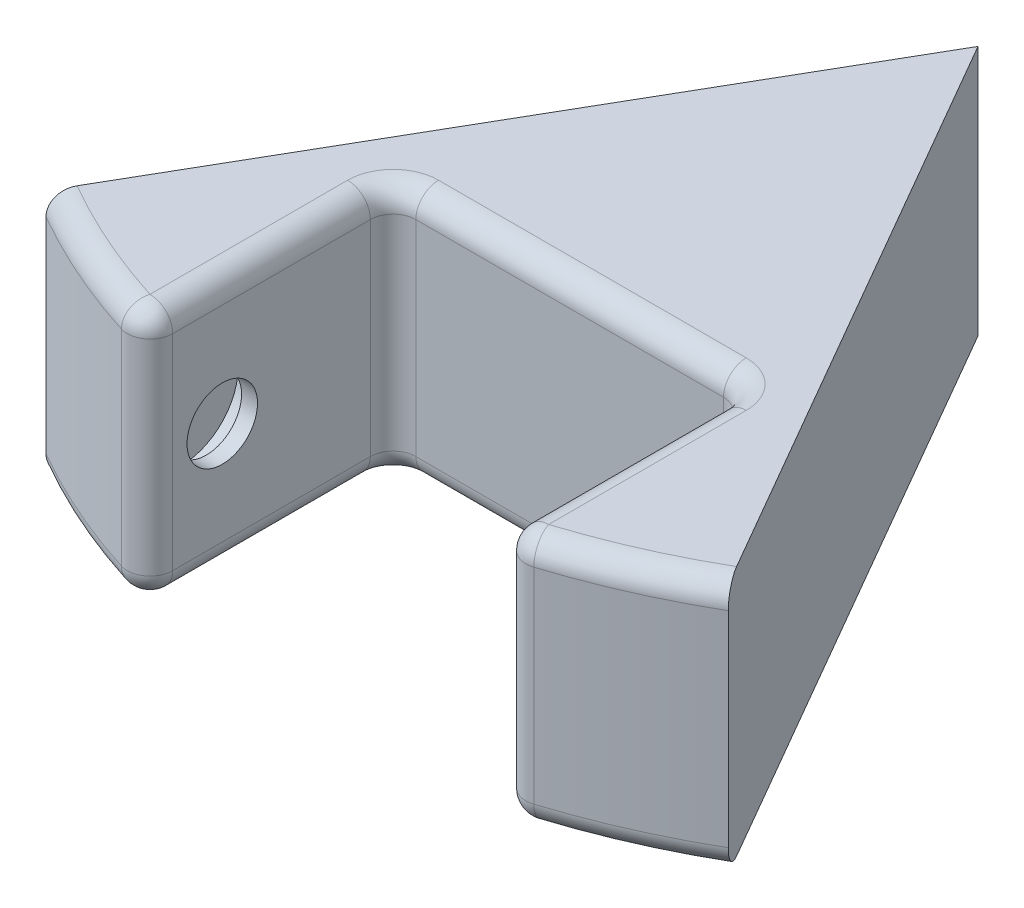
ISO-10303-21;
HEADER;
FILE_DESCRIPTION(('STEP AP214'),'2;1');
FILE_NAME('part.step','',(''),(''),'','','');
FILE_SCHEMA(('AUTOMOTIVE_DESIGN { 1 0 10303 214 1 1 1 1 }'));
ENDSEC;
DATA;
#1=APPLICATION_CONTEXT('core data for automotive mechanical design processes');
#2=APPLICATION_PROTOCOL_DEFINITION('international standard','automotive_design',2000,#1);
#3=PRODUCT_CONTEXT('',#1,'mechanical');
#4=PRODUCT('Part','Part','',(#3));
#5=PRODUCT_RELATED_PRODUCT_CATEGORY('part','',(#4));
#6=PRODUCT_DEFINITION_FORMATION('','',#4);
#7=PRODUCT_DEFINITION_CONTEXT('part definition',#1,'design');
#8=PRODUCT_DEFINITION('design','',#6,#7);
#9=PRODUCT_DEFINITION_SHAPE('','',#8);
#10=(LENGTH_UNIT() NAMED_UNIT(*) SI_UNIT(.MILLI.,.METRE.));
#11=(NAMED_UNIT(*) PLANE_ANGLE_UNIT() SI_UNIT($,.RADIAN.));
#12=(NAMED_UNIT(*) SI_UNIT($,.STERADIAN.) SOLID_ANGLE_UNIT());
#13=UNCERTAINTY_MEASURE_WITH_UNIT(LENGTH_MEASURE(1.E-05),#10,'distance_accuracy_value','');
#14=(GEOMETRIC_REPRESENTATION_CONTEXT(3) GLOBAL_UNCERTAINTY_ASSIGNED_CONTEXT((#13)) GLOBAL_UNIT_ASSIGNED_CONTEXT((#10,
#11,#12)) REPRESENTATION_CONTEXT('',''));
#15=CARTESIAN_POINT('',(0.,0.,0.));
#16=DIRECTION('',(0.,0.,1.));
#17=DIRECTION('',(1.,0.,0.));
#18=AXIS2_PLACEMENT_3D('',#15,#16,#17);
#19=CARTESIAN_POINT('',(-38.1000000000001,28.,65.9911357683742));
#20=DIRECTION('',(0.866025403784438,0.,0.500000000000001));
#21=DIRECTION('',(0.500000000000001,0.,-0.866025403784438));
#22=AXIS2_PLACEMENT_3D('',#19,#20,#21);
#23=PLANE('',#22);
#24=DIRECTION('',(-0.500000000000001,0.,0.866025403784438));
#25=VECTOR('',#24,1.);
#26=CARTESIAN_POINT('',(-38.1000000000001,0.,65.9911357683742));
#27=LINE('',#26,#25);
#28=CARTESIAN_POINT('',(0.,0.,0.));
#29=VERTEX_POINT('',#28);
#30=CARTESIAN_POINT('',(-36.8300000000001,0.,63.7914312427617));
#31=VERTEX_POINT('',#30);
#32=EDGE_CURVE('E200',#29,#31,#27,.T.);
#33=ORIENTED_EDGE('',*,*,#32,.T.);
#34=CARTESIAN_POINT('',(-36.8300000000001,2.54,63.7914312427617));
#35=DIRECTION('',(0.866025403784438,0.,0.500000000000001));
#36=DIRECTION('',(0.500000000000001,0.,-0.866025403784438));
#37=AXIS2_PLACEMENT_3D('',#34,#35,#36);
#38=CIRCLE('',#37,2.54);
#39=CARTESIAN_POINT('',(-38.1000000000001,2.54,65.9911357683742));
#40=VERTEX_POINT('',#39);
#41=EDGE_CURVE('E280',#31,#40,#38,.F.);
#42=ORIENTED_EDGE('',*,*,#41,.T.);
#43=DIRECTION('',(0.,-1.,0.));
#44=VECTOR('',#43,1.);
#45=CARTESIAN_POINT('',(-38.1000000000001,28.,65.9911357683742));
#46=LINE('',#45,#44);
#47=CARTESIAN_POINT('',(-38.1000000000001,25.46,65.9911357683742));
#48=VERTEX_POINT('',#47);
#49=EDGE_CURVE('E195',#48,#40,#46,.T.);
#50=ORIENTED_EDGE('',*,*,#49,.F.);
#51=CARTESIAN_POINT('',(-36.8300000000001,25.46,63.7914312427617));
#52=DIRECTION('',(0.866025403784438,0.,0.500000000000001));
#53=DIRECTION('',(0.500000000000001,0.,-0.866025403784438));
#54=AXIS2_PLACEMENT_3D('',#51,#52,#53);
#55=CIRCLE('',#54,2.54);
#56=CARTESIAN_POINT('',(-36.8300000000001,28.,63.7914312427617));
#57=VERTEX_POINT('',#56);
#58=EDGE_CURVE('E199',#48,#57,#55,.F.);
#59=ORIENTED_EDGE('',*,*,#58,.T.);
#60=DIRECTION('',(-0.500000000000001,0.,0.866025403784438));
#61=VECTOR('',#60,1.);
#62=CARTESIAN_POINT('',(-38.1000000000001,28.,65.9911357683742));
#63=LINE('',#62,#61);
#64=CARTESIAN_POINT('',(0.,28.,0.));
#65=VERTEX_POINT('',#64);
#66=EDGE_CURVE('E177',#65,#57,#63,.T.);
#67=ORIENTED_EDGE('',*,*,#66,.F.);
#68=DIRECTION('',(0.,-1.,0.));
#69=VECTOR('',#68,1.);
#70=CARTESIAN_POINT('',(0.,28.,0.));
#71=LINE('',#70,#69);
#72=EDGE_CURVE('E187',#65,#29,#71,.T.);
#73=ORIENTED_EDGE('',*,*,#72,.T.);
#74=EDGE_LOOP('',(#33,#42,#50,#59,#67,#73));
#75=FACE_BOUND('',#74,.T.);
#76=ADVANCED_FACE('F38',(#75),#23,.F.);
#77=CARTESIAN_POINT('',(0.,28.,0.));
#78=DIRECTION('',(0.,-1.,0.));
#79=DIRECTION('',(0.,0.,-1.));
#80=AXIS2_PLACEMENT_3D('',#77,#78,#79);
#81=CYLINDRICAL_SURFACE('',#80,76.2);
#82=ORIENTED_EDGE('',*,*,#49,.T.);
#83=CARTESIAN_POINT('',(0.,2.54,0.));
#84=DIRECTION('',(0.,-1.,0.));
#85=DIRECTION('',(0.,0.,-1.));
#86=AXIS2_PLACEMENT_3D('',#83,#84,#85);
#87=CIRCLE('',#86,76.2);
#88=CARTESIAN_POINT('',(-23.0296667967022,2.54,72.6365916548462));
#89=VERTEX_POINT('',#88);
#90=EDGE_CURVE('E216',#40,#89,#87,.F.);
#91=ORIENTED_EDGE('',*,*,#90,.T.);
#92=DIRECTION('',(0.,-1.,0.));
#93=VECTOR('',#92,1.);
#94=CARTESIAN_POINT('',(-23.0296667967022,28.,72.6365916548462));
#95=LINE('',#94,#93);
#96=CARTESIAN_POINT('',(-23.0296667967022,25.46,72.6365916548462));
#97=VERTEX_POINT('',#96);
#98=EDGE_CURVE('E213',#89,#97,#95,.F.);
#99=ORIENTED_EDGE('',*,*,#98,.T.);
#100=CARTESIAN_POINT('',(0.,25.46,0.));
#101=DIRECTION('',(0.,-1.,0.));
#102=DIRECTION('',(0.,0.,-1.));
#103=AXIS2_PLACEMENT_3D('',#100,#101,#102);
#104=CIRCLE('',#103,76.2);
#105=EDGE_CURVE('E211',#97,#48,#104,.T.);
#106=ORIENTED_EDGE('',*,*,#105,.T.);
#107=EDGE_LOOP('',(#82,#91,#99,#106));
#108=FACE_BOUND('',#107,.T.);
#109=ADVANCED_FACE('F391',(#108),#81,.T.);
#110=CARTESIAN_POINT('',(0.,28.,0.));
#111=DIRECTION('',(0.,-1.,0.));
#112=DIRECTION('',(0.,0.,-1.));
#113=AXIS2_PLACEMENT_3D('',#110,#111,#112);
#114=PLANE('',#113);
#115=ORIENTED_EDGE('',*,*,#66,.T.);
#116=CARTESIAN_POINT('',(0.,28.,0.));
#117=DIRECTION('',(0.,-1.,0.));
#118=DIRECTION('',(0.,0.,-1.));
#119=AXIS2_PLACEMENT_3D('',#116,#117,#118);
#120=CIRCLE('',#119,73.66);
#121=CARTESIAN_POINT('',(-22.2620112368121,28.,70.215371933018));
#122=VERTEX_POINT('',#121);
#123=EDGE_CURVE('E270',#57,#122,#120,.F.);
#124=ORIENTED_EDGE('',*,*,#123,.T.);
#125=DIRECTION('',(0.,0.,-1.));
#126=VECTOR('',#125,1.);
#127=CARTESIAN_POINT('',(-22.2620112368121,28.,0.));
#128=LINE('',#127,#126);
#129=CARTESIAN_POINT('',(-22.2620112368121,28.,48.143553163227));
#130=VERTEX_POINT('',#129);
#131=EDGE_CURVE('E268',#122,#130,#128,.T.);
#132=ORIENTED_EDGE('',*,*,#131,.T.);
#133=CARTESIAN_POINT('',(-17.1820112368121,28.,48.143553163227));
#134=DIRECTION('',(0.,-1.,0.));
#135=DIRECTION('',(0.,0.,-1.));
#136=AXIS2_PLACEMENT_3D('',#133,#134,#135);
#137=CIRCLE('',#136,5.08);
#138=CARTESIAN_POINT('',(-17.1820112368121,28.,43.063553163227));
#139=VERTEX_POINT('',#138);
#140=EDGE_CURVE('E265',#139,#130,#137,.F.);
#141=ORIENTED_EDGE('',*,*,#140,.F.);
#142=DIRECTION('',(1.,0.,0.));
#143=VECTOR('',#142,1.);
#144=CARTESIAN_POINT('',(0.,28.,43.063553163227));
#145=LINE('',#144,#143);
#146=CARTESIAN_POINT('',(17.1820112368121,28.,43.063553163227));
#147=VERTEX_POINT('',#146);
#148=EDGE_CURVE('E263',#139,#147,#145,.T.);
#149=ORIENTED_EDGE('',*,*,#148,.T.);
#150=CARTESIAN_POINT('',(17.1820112368121,28.,48.143553163227));
#151=DIRECTION('',(0.,-1.,0.));
#152=DIRECTION('',(0.,0.,-1.));
#153=AXIS2_PLACEMENT_3D('',#150,#151,#152);
#154=CIRCLE('',#153,5.08);
#155=CARTESIAN_POINT('',(22.2620112368121,28.,48.143553163227));
#156=VERTEX_POINT('',#155);
#157=EDGE_CURVE('E260',#156,#147,#154,.F.);
#158=ORIENTED_EDGE('',*,*,#157,.F.);
#159=DIRECTION('',(0.,0.,-1.));
#160=VECTOR('',#159,1.);
#161=CARTESIAN_POINT('',(22.2620112368121,28.,0.));
#162=LINE('',#161,#160);
#163=CARTESIAN_POINT('',(22.2620112368121,28.,70.215371933018));
#164=VERTEX_POINT('',#163);
#165=EDGE_CURVE('E258',#156,#164,#162,.F.);
#166=ORIENTED_EDGE('',*,*,#165,.T.);
#167=CARTESIAN_POINT('',(0.,28.,0.));
#168=DIRECTION('',(0.,-1.,0.));
#169=DIRECTION('',(0.,0.,-1.));
#170=AXIS2_PLACEMENT_3D('',#167,#168,#169);
#171=CIRCLE('',#170,73.66);
#172=CARTESIAN_POINT('',(36.8300000000001,28.,63.7914312427617));
#173=VERTEX_POINT('',#172);
#174=EDGE_CURVE('E180',#164,#173,#171,.F.);
#175=ORIENTED_EDGE('',*,*,#174,.T.);
#176=DIRECTION('',(0.500000000000001,0.,0.866025403784438));
#177=VECTOR('',#176,1.);
#178=CARTESIAN_POINT('',(38.1000000000001,28.,65.9911357683742));
#179=LINE('',#178,#177);
#180=EDGE_CURVE('E173',#65,#173,#179,.T.);
#181=ORIENTED_EDGE('',*,*,#180,.F.);
#182=EDGE_LOOP('',(#115,#124,#132,#141,#149,#158,#166,#175,#181));
#183=FACE_BOUND('',#182,.T.);
#184=ADVANCED_FACE('F175',(#183),#114,.F.);
#185=CARTESIAN_POINT('',(0.,0.,0.));
#186=DIRECTION('',(0.,-1.,0.));
#187=DIRECTION('',(0.,0.,-1.));
#188=AXIS2_PLACEMENT_3D('',#185,#186,#187);
#189=PLANE('',#188);
#190=DIRECTION('',(0.,0.,1.));
#191=VECTOR('',#190,1.);
#192=CARTESIAN_POINT('',(-22.2620112368121,0.,73.603547963227));
#193=LINE('',#192,#191);
#194=CARTESIAN_POINT('',(-22.2620112368121,0.,48.143553163227));
#195=VERTEX_POINT('',#194);
#196=CARTESIAN_POINT('',(-22.2620112368121,0.,70.215371933018));
#197=VERTEX_POINT('',#196);
#198=EDGE_CURVE('E253',#195,#197,#193,.T.);
#199=ORIENTED_EDGE('',*,*,#198,.T.);
#200=CARTESIAN_POINT('',(0.,0.,0.));
#201=DIRECTION('',(0.,-1.,0.));
#202=DIRECTION('',(0.,0.,-1.));
#203=AXIS2_PLACEMENT_3D('',#200,#201,#202);
#204=CIRCLE('',#203,73.66);
#205=EDGE_CURVE('E255',#197,#31,#204,.T.);
#206=ORIENTED_EDGE('',*,*,#205,.T.);
#207=ORIENTED_EDGE('',*,*,#32,.F.);
#208=DIRECTION('',(0.500000000000001,0.,0.866025403784438));
#209=VECTOR('',#208,1.);
#210=CARTESIAN_POINT('',(38.1000000000001,0.,65.9911357683742));
#211=LINE('',#210,#209);
#212=CARTESIAN_POINT('',(36.8300000000001,0.,63.7914312427617));
#213=VERTEX_POINT('',#212);
#214=EDGE_CURVE('E184',#29,#213,#211,.T.);
#215=ORIENTED_EDGE('',*,*,#214,.T.);
#216=CARTESIAN_POINT('',(0.,0.,0.));
#217=DIRECTION('',(0.,-1.,0.));
#218=DIRECTION('',(0.,0.,-1.));
#219=AXIS2_PLACEMENT_3D('',#216,#217,#218);
#220=CIRCLE('',#219,73.66);
#221=CARTESIAN_POINT('',(22.2620112368121,0.,70.215371933018));
#222=VERTEX_POINT('',#221);
#223=EDGE_CURVE('E242',#213,#222,#220,.T.);
#224=ORIENTED_EDGE('',*,*,#223,.T.);
#225=DIRECTION('',(0.,0.,1.));
#226=VECTOR('',#225,1.);
#227=CARTESIAN_POINT('',(22.2620112368121,0.,45.603553163227));
#228=LINE('',#227,#226);
#229=CARTESIAN_POINT('',(22.2620112368121,0.,48.143553163227));
#230=VERTEX_POINT('',#229);
#231=EDGE_CURVE('E244',#222,#230,#228,.F.);
#232=ORIENTED_EDGE('',*,*,#231,.T.);
#233=CARTESIAN_POINT('',(17.1820112368121,0.,48.143553163227));
#234=DIRECTION('',(0.,-1.,0.));
#235=DIRECTION('',(0.,0.,-1.));
#236=AXIS2_PLACEMENT_3D('',#233,#234,#235);
#237=CIRCLE('',#236,5.08);
#238=CARTESIAN_POINT('',(17.1820112368121,0.,43.063553163227));
#239=VERTEX_POINT('',#238);
#240=EDGE_CURVE('E246',#239,#230,#237,.T.);
#241=ORIENTED_EDGE('',*,*,#240,.F.);
#242=DIRECTION('',(1.,0.,0.));
#243=VECTOR('',#242,1.);
#244=CARTESIAN_POINT('',(-19.7220112368121,0.,43.063553163227));
#245=LINE('',#244,#243);
#246=CARTESIAN_POINT('',(-17.1820112368121,0.,43.063553163227));
#247=VERTEX_POINT('',#246);
#248=EDGE_CURVE('E249',#239,#247,#245,.F.);
#249=ORIENTED_EDGE('',*,*,#248,.T.);
#250=CARTESIAN_POINT('',(-17.1820112368121,0.,48.143553163227));
#251=DIRECTION('',(0.,-1.,0.));
#252=DIRECTION('',(0.,0.,-1.));
#253=AXIS2_PLACEMENT_3D('',#250,#251,#252);
#254=CIRCLE('',#253,5.08);
#255=EDGE_CURVE('E251',#195,#247,#254,.T.);
#256=ORIENTED_EDGE('',*,*,#255,.F.);
#257=EDGE_LOOP('',(#199,#206,#207,#215,#224,#232,#241,#249,#256));
#258=FACE_BOUND('',#257,.T.);
#259=ADVANCED_FACE('F378',(#258),#189,.T.);
#260=CARTESIAN_POINT('',(-19.7220112368121,0.,73.603547963227));
#261=DIRECTION('',(-1.,0.,0.));
#262=DIRECTION('',(0.,0.,1.));
#263=AXIS2_PLACEMENT_3D('',#260,#261,#262);
#264=PLANE('',#263);
#265=DIRECTION('',(0.,0.,-1.));
#266=VECTOR('',#265,1.);
#267=CARTESIAN_POINT('',(-19.7220112368121,25.46,73.603547963227));
#268=LINE('',#267,#266);
#269=CARTESIAN_POINT('',(-19.7220112368121,25.46,48.143553163227));
#270=VERTEX_POINT('',#269);
#271=CARTESIAN_POINT('',(-19.7220112368121,25.46,70.215371933018));
#272=VERTEX_POINT('',#271);
#273=EDGE_CURVE('E220',#270,#272,#268,.F.);
#274=ORIENTED_EDGE('',*,*,#273,.T.);
#275=DIRECTION('',(0.,-1.,0.));
#276=VECTOR('',#275,1.);
#277=CARTESIAN_POINT('',(-19.7220112368121,0.,70.215371933018));
#278=LINE('',#277,#276);
#279=CARTESIAN_POINT('',(-19.7220112368121,2.54,70.215371933018));
#280=VERTEX_POINT('',#279);
#281=EDGE_CURVE('E224',#272,#280,#278,.T.);
#282=ORIENTED_EDGE('',*,*,#281,.T.);
#283=DIRECTION('',(0.,0.,1.));
#284=VECTOR('',#283,1.);
#285=CARTESIAN_POINT('',(-19.7220112368121,2.54,45.603553163227));
#286=LINE('',#285,#284);
#287=CARTESIAN_POINT('',(-19.7220112368121,2.54,48.143553163227));
#288=VERTEX_POINT('',#287);
#289=EDGE_CURVE('E222',#280,#288,#286,.F.);
#290=ORIENTED_EDGE('',*,*,#289,.T.);
#291=DIRECTION('',(0.,1.,0.));
#292=VECTOR('',#291,1.);
#293=CARTESIAN_POINT('',(-19.7220112368121,28.,48.143553163227));
#294=LINE('',#293,#292);
#295=EDGE_CURVE('E218',#288,#270,#294,.T.);
#296=ORIENTED_EDGE('',*,*,#295,.T.);
#297=EDGE_LOOP('',(#274,#282,#290,#296));
#298=FACE_BOUND('',#297,.T.);
#299=CARTESIAN_POINT('',(-19.7220112368121,14.,64.683550563227));
#300=DIRECTION('',(1.,0.,0.));
#301=DIRECTION('',(0.,0.,-1.));
#302=AXIS2_PLACEMENT_3D('',#299,#300,#301);
#303=CIRCLE('',#302,3.93699999999999);
#304=CARTESIAN_POINT('',(-19.7220112368121,14.,60.746550563227));
#305=VERTEX_POINT('',#304);
#306=EDGE_CURVE('E367',#305,#305,#303,.T.);
#307=ORIENTED_EDGE('',*,*,#306,.F.);
#308=EDGE_LOOP('',(#307));
#309=FACE_BOUND('',#308,.T.);
#310=ADVANCED_FACE('F375',(#298,#309),#264,.F.);
#311=CARTESIAN_POINT('',(-19.7220112368121,0.,45.603553163227));
#312=DIRECTION('',(0.,0.,-1.));
#313=DIRECTION('',(-1.,0.,0.));
#314=AXIS2_PLACEMENT_3D('',#311,#312,#313);
#315=PLANE('',#314);
#316=DIRECTION('',(0.,1.,0.));
#317=VECTOR('',#316,1.);
#318=CARTESIAN_POINT('',(-17.1820112368121,0.,45.603553163227));
#319=LINE('',#318,#317);
#320=CARTESIAN_POINT('',(-17.1820112368121,25.46,45.603553163227));
#321=VERTEX_POINT('',#320);
#322=CARTESIAN_POINT('',(-17.1820112368121,2.54,45.603553163227));
#323=VERTEX_POINT('',#322);
#324=EDGE_CURVE('E276',#321,#323,#319,.F.);
#325=ORIENTED_EDGE('',*,*,#324,.T.);
#326=DIRECTION('',(1.,0.,0.));
#327=VECTOR('',#326,1.);
#328=CARTESIAN_POINT('',(19.7220112368121,2.54,45.603553163227));
#329=LINE('',#328,#327);
#330=CARTESIAN_POINT('',(17.1820112368121,2.54,45.603553163227));
#331=VERTEX_POINT('',#330);
#332=EDGE_CURVE('E63',#323,#331,#329,.T.);
#333=ORIENTED_EDGE('',*,*,#332,.T.);
#334=DIRECTION('',(0.,1.,0.));
#335=VECTOR('',#334,1.);
#336=CARTESIAN_POINT('',(17.1820112368121,28.,45.603553163227));
#337=LINE('',#336,#335);
#338=CARTESIAN_POINT('',(17.1820112368121,25.46,45.603553163227));
#339=VERTEX_POINT('',#338);
#340=EDGE_CURVE('E274',#331,#339,#337,.T.);
#341=ORIENTED_EDGE('',*,*,#340,.T.);
#342=DIRECTION('',(1.,0.,0.));
#343=VECTOR('',#342,1.);
#344=CARTESIAN_POINT('',(-19.7220112368121,25.46,45.603553163227));
#345=LINE('',#344,#343);
#346=EDGE_CURVE('E272',#339,#321,#345,.F.);
#347=ORIENTED_EDGE('',*,*,#346,.T.);
#348=EDGE_LOOP('',(#325,#333,#341,#347));
#349=FACE_BOUND('',#348,.T.);
#350=ADVANCED_FACE('F377',(#349),#315,.F.);
#351=CARTESIAN_POINT('',(-21.5000112368121,14.,64.683550563227));
#352=DIRECTION('',(1.,0.,0.));
#353=DIRECTION('',(0.,0.,-1.));
#354=AXIS2_PLACEMENT_3D('',#351,#352,#353);
#355=PLANE('',#354);
#356=CARTESIAN_POINT('',(-21.5000112368121,14.,64.683550563227));
#357=DIRECTION('',(1.,0.,0.));
#358=DIRECTION('',(0.,0.,-1.));
#359=AXIS2_PLACEMENT_3D('',#356,#357,#358);
#360=CIRCLE('',#359,3.93699999999999);
#361=CARTESIAN_POINT('',(-21.5000112368121,14.,60.746550563227));
#362=VERTEX_POINT('',#361);
#363=EDGE_CURVE('E368',#362,#362,#360,.T.);
#364=ORIENTED_EDGE('',*,*,#363,.T.);
#365=EDGE_LOOP('',(#364));
#366=FACE_BOUND('',#365,.T.);
#367=CARTESIAN_POINT('',(-21.5000112368121,14.,64.683550563227));
#368=DIRECTION('',(1.,0.,0.));
#369=DIRECTION('',(0.,0.,-1.));
#370=AXIS2_PLACEMENT_3D('',#367,#368,#369);
#371=CIRCLE('',#370,6.35);
#372=CARTESIAN_POINT('',(-21.5000112368121,14.,58.333550563227));
#373=VERTEX_POINT('',#372);
#374=EDGE_CURVE('E194',#373,#373,#371,.F.);
#375=ORIENTED_EDGE('',*,*,#374,.T.);
#376=EDGE_LOOP('',(#375));
#377=FACE_BOUND('',#376,.T.);
#378=ADVANCED_FACE('F385',(#366,#377),#355,.F.);
#379=CARTESIAN_POINT('',(-21.5000112368121,14.,64.683550563227));
#380=DIRECTION('',(1.,0.,0.));
#381=DIRECTION('',(0.,0.,-1.));
#382=AXIS2_PLACEMENT_3D('',#379,#380,#381);
#383=CYLINDRICAL_SURFACE('',#382,3.93699999999999);
#384=ORIENTED_EDGE('',*,*,#363,.F.);
#385=EDGE_LOOP('',(#384));
#386=FACE_BOUND('',#385,.T.);
#387=ORIENTED_EDGE('',*,*,#306,.T.);
#388=EDGE_LOOP('',(#387));
#389=FACE_BOUND('',#388,.T.);
#390=ADVANCED_FACE('F373',(#386,#389),#383,.F.);
#391=CARTESIAN_POINT('',(-24.2940112368121,14.,64.683550563227));
#392=DIRECTION('',(1.,0.,0.));
#393=DIRECTION('',(0.,0.,-1.));
#394=AXIS2_PLACEMENT_3D('',#391,#392,#393);
#395=PLANE('',#394);
#396=CARTESIAN_POINT('',(-24.2940112368121,14.,64.683550563227));
#397=DIRECTION('',(1.,0.,0.));
#398=DIRECTION('',(0.,0.,-1.));
#399=AXIS2_PLACEMENT_3D('',#396,#397,#398);
#400=CIRCLE('',#399,6.35);
#401=CARTESIAN_POINT('',(-24.2940112368121,14.,58.333550563227));
#402=VERTEX_POINT('',#401);
#403=EDGE_CURVE('E204',#402,#402,#400,.T.);
#404=ORIENTED_EDGE('',*,*,#403,.T.);
#405=EDGE_LOOP('',(#404));
#406=FACE_BOUND('',#405,.T.);
#407=ADVANCED_FACE('F552',(#406),#395,.T.);
#408=CARTESIAN_POINT('',(-24.2940112368121,14.,64.683550563227));
#409=DIRECTION('',(1.,0.,0.));
#410=DIRECTION('',(0.,0.,-1.));
#411=AXIS2_PLACEMENT_3D('',#408,#409,#410);
#412=CYLINDRICAL_SURFACE('',#411,6.35);
#413=ORIENTED_EDGE('',*,*,#403,.F.);
#414=EDGE_LOOP('',(#413));
#415=FACE_BOUND('',#414,.T.);
#416=ORIENTED_EDGE('',*,*,#374,.F.);
#417=EDGE_LOOP('',(#416));
#418=FACE_BOUND('',#417,.T.);
#419=ADVANCED_FACE('F549',(#415,#418),#412,.F.);
#420=CARTESIAN_POINT('',(38.1000000000001,28.,65.9911357683742));
#421=DIRECTION('',(-0.866025403784438,0.,0.500000000000001));
#422=DIRECTION('',(-0.500000000000001,0.,-0.866025403784438));
#423=AXIS2_PLACEMENT_3D('',#420,#421,#422);
#424=PLANE('',#423);
#425=DIRECTION('',(0.,-1.,0.));
#426=VECTOR('',#425,1.);
#427=CARTESIAN_POINT('',(38.1000000000001,28.,65.9911357683742));
#428=LINE('',#427,#426);
#429=CARTESIAN_POINT('',(38.1000000000001,25.46,65.9911357683742));
#430=VERTEX_POINT('',#429);
#431=CARTESIAN_POINT('',(38.1000000000001,2.54,65.9911357683742));
#432=VERTEX_POINT('',#431);
#433=EDGE_CURVE('E183',#430,#432,#428,.T.);
#434=ORIENTED_EDGE('',*,*,#433,.T.);
#435=CARTESIAN_POINT('',(36.8300000000001,2.54,63.7914312427617));
#436=DIRECTION('',(-0.866025403784438,0.,0.500000000000001));
#437=DIRECTION('',(0.500000000000001,0.,0.866025403784438));
#438=AXIS2_PLACEMENT_3D('',#435,#436,#437);
#439=CIRCLE('',#438,2.54);
#440=EDGE_CURVE('E12',#432,#213,#439,.F.);
#441=ORIENTED_EDGE('',*,*,#440,.T.);
#442=ORIENTED_EDGE('',*,*,#214,.F.);
#443=ORIENTED_EDGE('',*,*,#72,.F.);
#444=ORIENTED_EDGE('',*,*,#180,.T.);
#445=CARTESIAN_POINT('',(36.8300000000001,25.46,63.7914312427617));
#446=DIRECTION('',(-0.866025403784438,0.,0.500000000000001));
#447=DIRECTION('',(0.500000000000001,0.,0.866025403784438));
#448=AXIS2_PLACEMENT_3D('',#445,#446,#447);
#449=CIRCLE('',#448,2.54);
#450=EDGE_CURVE('E47',#173,#430,#449,.F.);
#451=ORIENTED_EDGE('',*,*,#450,.T.);
#452=EDGE_LOOP('',(#434,#441,#442,#443,#444,#451));
#453=FACE_BOUND('',#452,.T.);
#454=ADVANCED_FACE('F189',(#453),#424,.F.);
#455=CARTESIAN_POINT('',(0.,28.,0.));
#456=DIRECTION('',(0.,-1.,0.));
#457=DIRECTION('',(0.,0.,-1.));
#458=AXIS2_PLACEMENT_3D('',#455,#456,#457);
#459=CYLINDRICAL_SURFACE('',#458,76.2);
#460=DIRECTION('',(0.,-1.,0.));
#461=VECTOR('',#460,1.);
#462=CARTESIAN_POINT('',(23.0296667967022,28.,72.6365916548462));
#463=LINE('',#462,#461);
#464=CARTESIAN_POINT('',(23.0296667967022,25.46,72.6365916548462));
#465=VERTEX_POINT('',#464);
#466=CARTESIAN_POINT('',(23.0296667967022,2.54,72.6365916548462));
#467=VERTEX_POINT('',#466);
#468=EDGE_CURVE('E238',#465,#467,#463,.T.);
#469=ORIENTED_EDGE('',*,*,#468,.T.);
#470=CARTESIAN_POINT('',(0.,2.54,0.));
#471=DIRECTION('',(0.,-1.,0.));
#472=DIRECTION('',(0.,0.,-1.));
#473=AXIS2_PLACEMENT_3D('',#470,#471,#472);
#474=CIRCLE('',#473,76.2);
#475=EDGE_CURVE('E240',#467,#432,#474,.F.);
#476=ORIENTED_EDGE('',*,*,#475,.T.);
#477=ORIENTED_EDGE('',*,*,#433,.F.);
#478=CARTESIAN_POINT('',(0.,25.46,0.));
#479=DIRECTION('',(0.,-1.,0.));
#480=DIRECTION('',(0.,0.,-1.));
#481=AXIS2_PLACEMENT_3D('',#478,#479,#480);
#482=CIRCLE('',#481,76.2);
#483=EDGE_CURVE('E236',#430,#465,#482,.T.);
#484=ORIENTED_EDGE('',*,*,#483,.T.);
#485=EDGE_LOOP('',(#469,#476,#477,#484));
#486=FACE_BOUND('',#485,.T.);
#487=ADVANCED_FACE('F489',(#486),#459,.T.);
#488=CARTESIAN_POINT('',(19.7220112368121,0.,73.603547963227));
#489=DIRECTION('',(1.,0.,0.));
#490=DIRECTION('',(0.,0.,1.));
#491=AXIS2_PLACEMENT_3D('',#488,#489,#490);
#492=PLANE('',#491);
#493=DIRECTION('',(0.,0.,1.));
#494=VECTOR('',#493,1.);
#495=CARTESIAN_POINT('',(19.7220112368121,2.54,73.603547963227));
#496=LINE('',#495,#494);
#497=CARTESIAN_POINT('',(19.7220112368121,2.54,48.143553163227));
#498=VERTEX_POINT('',#497);
#499=CARTESIAN_POINT('',(19.7220112368121,2.54,70.215371933018));
#500=VERTEX_POINT('',#499);
#501=EDGE_CURVE('E231',#498,#500,#496,.T.);
#502=ORIENTED_EDGE('',*,*,#501,.T.);
#503=DIRECTION('',(0.,-1.,0.));
#504=VECTOR('',#503,1.);
#505=CARTESIAN_POINT('',(19.7220112368121,0.,70.215371933018));
#506=LINE('',#505,#504);
#507=CARTESIAN_POINT('',(19.7220112368121,25.46,70.215371933018));
#508=VERTEX_POINT('',#507);
#509=EDGE_CURVE('E233',#500,#508,#506,.F.);
#510=ORIENTED_EDGE('',*,*,#509,.T.);
#511=DIRECTION('',(0.,0.,-1.));
#512=VECTOR('',#511,1.);
#513=CARTESIAN_POINT('',(19.7220112368121,25.46,73.603547963227));
#514=LINE('',#513,#512);
#515=CARTESIAN_POINT('',(19.7220112368121,25.46,48.143553163227));
#516=VERTEX_POINT('',#515);
#517=EDGE_CURVE('E229',#508,#516,#514,.T.);
#518=ORIENTED_EDGE('',*,*,#517,.T.);
#519=DIRECTION('',(0.,1.,0.));
#520=VECTOR('',#519,1.);
#521=CARTESIAN_POINT('',(19.7220112368121,0.,48.143553163227));
#522=LINE('',#521,#520);
#523=EDGE_CURVE('E227',#516,#498,#522,.F.);
#524=ORIENTED_EDGE('',*,*,#523,.T.);
#525=EDGE_LOOP('',(#502,#510,#518,#524));
#526=FACE_BOUND('',#525,.T.);
#527=CARTESIAN_POINT('',(19.7220112368121,14.,64.683550563227));
#528=DIRECTION('',(1.,0.,0.));
#529=DIRECTION('',(0.,0.,-1.));
#530=AXIS2_PLACEMENT_3D('',#527,#528,#529);
#531=CIRCLE('',#530,3.93699999999999);
#532=CARTESIAN_POINT('',(19.7220112368121,14.,60.746550563227));
#533=VERTEX_POINT('',#532);
#534=EDGE_CURVE('E349',#533,#533,#531,.T.);
#535=ORIENTED_EDGE('',*,*,#534,.T.);
#536=EDGE_LOOP('',(#535));
#537=FACE_BOUND('',#536,.T.);
#538=ADVANCED_FACE('F496',(#526,#537),#492,.F.);
#539=CARTESIAN_POINT('',(21.5000112368121,14.,64.683550563227));
#540=DIRECTION('',(-1.,0.,0.));
#541=DIRECTION('',(0.,0.,-1.));
#542=AXIS2_PLACEMENT_3D('',#539,#540,#541);
#543=PLANE('',#542);
#544=CARTESIAN_POINT('',(21.5000112368121,14.,64.683550563227));
#545=DIRECTION('',(1.,0.,0.));
#546=DIRECTION('',(0.,0.,-1.));
#547=AXIS2_PLACEMENT_3D('',#544,#545,#546);
#548=CIRCLE('',#547,3.93699999999999);
#549=CARTESIAN_POINT('',(21.5000112368121,14.,60.746550563227));
#550=VERTEX_POINT('',#549);
#551=EDGE_CURVE('E352',#550,#550,#548,.T.);
#552=ORIENTED_EDGE('',*,*,#551,.F.);
#553=EDGE_LOOP('',(#552));
#554=FACE_BOUND('',#553,.T.);
#555=CARTESIAN_POINT('',(21.5000112368121,14.,64.683550563227));
#556=DIRECTION('',(1.,0.,0.));
#557=DIRECTION('',(0.,0.,-1.));
#558=AXIS2_PLACEMENT_3D('',#555,#556,#557);
#559=CIRCLE('',#558,6.35);
#560=CARTESIAN_POINT('',(21.5000112368121,14.,58.333550563227));
#561=VERTEX_POINT('',#560);
#562=EDGE_CURVE('E364',#561,#561,#559,.F.);
#563=ORIENTED_EDGE('',*,*,#562,.F.);
#564=EDGE_LOOP('',(#563));
#565=FACE_BOUND('',#564,.T.);
#566=ADVANCED_FACE('F534',(#554,#565),#543,.F.);
#567=CARTESIAN_POINT('',(21.5000112368121,14.,64.683550563227));
#568=DIRECTION('',(-1.,0.,0.));
#569=DIRECTION('',(0.,0.,-1.));
#570=AXIS2_PLACEMENT_3D('',#567,#568,#569);
#571=CYLINDRICAL_SURFACE('',#570,3.93699999999999);
#572=ORIENTED_EDGE('',*,*,#551,.T.);
#573=EDGE_LOOP('',(#572));
#574=FACE_BOUND('',#573,.T.);
#575=ORIENTED_EDGE('',*,*,#534,.F.);
#576=EDGE_LOOP('',(#575));
#577=FACE_BOUND('',#576,.T.);
#578=ADVANCED_FACE('F540',(#574,#577),#571,.F.);
#579=CARTESIAN_POINT('',(24.2940112368121,14.,64.683550563227));
#580=DIRECTION('',(-1.,0.,0.));
#581=DIRECTION('',(0.,0.,-1.));
#582=AXIS2_PLACEMENT_3D('',#579,#580,#581);
#583=PLANE('',#582);
#584=CARTESIAN_POINT('',(24.2940112368121,14.,64.683550563227));
#585=DIRECTION('',(1.,0.,0.));
#586=DIRECTION('',(0.,0.,-1.));
#587=AXIS2_PLACEMENT_3D('',#584,#585,#586);
#588=CIRCLE('',#587,6.35);
#589=CARTESIAN_POINT('',(24.2940112368121,14.,58.333550563227));
#590=VERTEX_POINT('',#589);
#591=EDGE_CURVE('E357',#590,#590,#588,.T.);
#592=ORIENTED_EDGE('',*,*,#591,.F.);
#593=EDGE_LOOP('',(#592));
#594=FACE_BOUND('',#593,.T.);
#595=ADVANCED_FACE('F727',(#594),#583,.T.);
#596=CARTESIAN_POINT('',(24.2940112368121,14.,64.683550563227));
#597=DIRECTION('',(-1.,0.,0.));
#598=DIRECTION('',(0.,0.,-1.));
#599=AXIS2_PLACEMENT_3D('',#596,#597,#598);
#600=CYLINDRICAL_SURFACE('',#599,6.35);
#601=ORIENTED_EDGE('',*,*,#591,.T.);
#602=EDGE_LOOP('',(#601));
#603=FACE_BOUND('',#602,.T.);
#604=ORIENTED_EDGE('',*,*,#562,.T.);
#605=EDGE_LOOP('',(#604));
#606=FACE_BOUND('',#605,.T.);
#607=ADVANCED_FACE('F482',(#603,#606),#600,.F.);
#608=CARTESIAN_POINT('',(0.,2.54,0.));
#609=DIRECTION('',(0.,-1.,0.));
#610=DIRECTION('',(0.,0.,-1.));
#611=AXIS2_PLACEMENT_3D('',#608,#609,#610);
#612=TOROIDAL_SURFACE('',#611,73.66,2.54);
#613=ORIENTED_EDGE('',*,*,#440,.F.);
#614=ORIENTED_EDGE('',*,*,#475,.F.);
#615=CARTESIAN_POINT('',(22.2620112368121,2.54,70.215371933018));
#616=DIRECTION('',(-0.953236110955986,0.,0.30222659838192));
#617=DIRECTION('',(0.30222659838192,0.,0.953236110955986));
#618=AXIS2_PLACEMENT_3D('',#615,#616,#617);
#619=CIRCLE('',#618,2.54);
#620=EDGE_CURVE('E343',#222,#467,#619,.T.);
#621=ORIENTED_EDGE('',*,*,#620,.F.);
#622=ORIENTED_EDGE('',*,*,#223,.F.);
#623=EDGE_LOOP('',(#613,#614,#621,#622));
#624=FACE_BOUND('',#623,.T.);
#625=ADVANCED_FACE('F40',(#624),#612,.T.);
#626=CARTESIAN_POINT('',(0.,25.46,0.));
#627=DIRECTION('',(0.,-1.,0.));
#628=DIRECTION('',(0.,0.,-1.));
#629=AXIS2_PLACEMENT_3D('',#626,#627,#628);
#630=TOROIDAL_SURFACE('',#629,73.66,2.54);
#631=ORIENTED_EDGE('',*,*,#450,.F.);
#632=ORIENTED_EDGE('',*,*,#174,.F.);
#633=CARTESIAN_POINT('',(22.2620112368121,25.46,70.215371933018));
#634=DIRECTION('',(-0.953236110955987,0.,0.302226598381919));
#635=DIRECTION('',(0.302226598381919,0.,0.953236110955987));
#636=AXIS2_PLACEMENT_3D('',#633,#634,#635);
#637=CIRCLE('',#636,2.54);
#638=EDGE_CURVE('E341',#465,#164,#637,.T.);
#639=ORIENTED_EDGE('',*,*,#638,.F.);
#640=ORIENTED_EDGE('',*,*,#483,.F.);
#641=EDGE_LOOP('',(#631,#632,#639,#640));
#642=FACE_BOUND('',#641,.T.);
#643=ADVANCED_FACE('F475',(#642),#630,.T.);
#644=CARTESIAN_POINT('',(22.2620112368121,28.,70.215371933018));
#645=DIRECTION('',(0.,-1.,0.));
#646=DIRECTION('',(0.,0.,-1.));
#647=AXIS2_PLACEMENT_3D('',#644,#645,#646);
#648=CYLINDRICAL_SURFACE('',#647,2.54);
#649=CARTESIAN_POINT('',(22.2620112368121,2.54,70.215371933018));
#650=DIRECTION('',(0.,-1.,0.));
#651=DIRECTION('',(1.,0.,0.));
#652=AXIS2_PLACEMENT_3D('',#649,#650,#651);
#653=CIRCLE('',#652,2.54);
#654=EDGE_CURVE('E42',#467,#500,#653,.T.);
#655=ORIENTED_EDGE('',*,*,#654,.F.);
#656=ORIENTED_EDGE('',*,*,#468,.F.);
#657=CARTESIAN_POINT('',(22.2620112368121,25.46,70.215371933018));
#658=DIRECTION('',(0.,1.,0.));
#659=DIRECTION('',(0.,0.,1.));
#660=AXIS2_PLACEMENT_3D('',#657,#658,#659);
#661=CIRCLE('',#660,2.54);
#662=EDGE_CURVE('E338',#508,#465,#661,.T.);
#663=ORIENTED_EDGE('',*,*,#662,.F.);
#664=ORIENTED_EDGE('',*,*,#509,.F.);
#665=EDGE_LOOP('',(#655,#656,#663,#664));
#666=FACE_BOUND('',#665,.T.);
#667=ADVANCED_FACE('F473',(#666),#648,.T.);
#668=CARTESIAN_POINT('',(22.2620112368121,2.54,70.215371933018));
#669=DIRECTION('',(0.,-1.,0.));
#670=DIRECTION('',(0.,0.,-1.));
#671=AXIS2_PLACEMENT_3D('',#668,#669,#670);
#672=SPHERICAL_SURFACE('',#671,2.54);
#673=ORIENTED_EDGE('',*,*,#620,.T.);
#674=ORIENTED_EDGE('',*,*,#654,.T.);
#675=CARTESIAN_POINT('',(22.2620112368121,2.54,70.215371933018));
#676=DIRECTION('',(0.,0.,1.));
#677=DIRECTION('',(0.,-1.,0.));
#678=AXIS2_PLACEMENT_3D('',#675,#676,#677);
#679=CIRCLE('',#678,2.54);
#680=EDGE_CURVE('E335',#222,#500,#679,.F.);
#681=ORIENTED_EDGE('',*,*,#680,.F.);
#682=EDGE_LOOP('',(#673,#674,#681));
#683=FACE_BOUND('',#682,.T.);
#684=ADVANCED_FACE('F469',(#683),#672,.T.);
#685=CARTESIAN_POINT('',(22.2620112368121,25.46,70.215371933018));
#686=DIRECTION('',(0.,1.,0.));
#687=DIRECTION('',(0.,0.,1.));
#688=AXIS2_PLACEMENT_3D('',#685,#686,#687);
#689=SPHERICAL_SURFACE('',#688,2.54);
#690=ORIENTED_EDGE('',*,*,#662,.T.);
#691=ORIENTED_EDGE('',*,*,#638,.T.);
#692=CARTESIAN_POINT('',(22.2620112368121,25.46,70.215371933018));
#693=DIRECTION('',(0.,0.,1.));
#694=DIRECTION('',(1.,0.,0.));
#695=AXIS2_PLACEMENT_3D('',#692,#693,#694);
#696=CIRCLE('',#695,2.54);
#697=EDGE_CURVE('E332',#508,#164,#696,.F.);
#698=ORIENTED_EDGE('',*,*,#697,.F.);
#699=EDGE_LOOP('',(#690,#691,#698));
#700=FACE_BOUND('',#699,.T.);
#701=ADVANCED_FACE('F465',(#700),#689,.T.);
#702=CARTESIAN_POINT('',(22.2620112368121,2.54,73.603547963227));
#703=DIRECTION('',(0.,0.,-1.));
#704=DIRECTION('',(-1.,0.,0.));
#705=AXIS2_PLACEMENT_3D('',#702,#703,#704);
#706=CYLINDRICAL_SURFACE('',#705,2.54);
#707=ORIENTED_EDGE('',*,*,#680,.T.);
#708=ORIENTED_EDGE('',*,*,#501,.F.);
#709=CARTESIAN_POINT('',(22.2620112368121,2.54,48.143553163227));
#710=DIRECTION('',(0.,0.,-1.));
#711=DIRECTION('',(-1.,0.,0.));
#712=AXIS2_PLACEMENT_3D('',#709,#710,#711);
#713=CIRCLE('',#712,2.54);
#714=EDGE_CURVE('E326',#230,#498,#713,.T.);
#715=ORIENTED_EDGE('',*,*,#714,.F.);
#716=ORIENTED_EDGE('',*,*,#231,.F.);
#717=EDGE_LOOP('',(#707,#708,#715,#716));
#718=FACE_BOUND('',#717,.T.);
#719=ADVANCED_FACE('F461',(#718),#706,.T.);
#720=CARTESIAN_POINT('',(22.2620112368121,25.46,73.603547963227));
#721=DIRECTION('',(0.,0.,-1.));
#722=DIRECTION('',(-1.,0.,0.));
#723=AXIS2_PLACEMENT_3D('',#720,#721,#722);
#724=CYLINDRICAL_SURFACE('',#723,2.54);
#725=ORIENTED_EDGE('',*,*,#697,.T.);
#726=ORIENTED_EDGE('',*,*,#165,.F.);
#727=CARTESIAN_POINT('',(22.2620112368121,25.46,48.143553163227));
#728=DIRECTION('',(0.,0.,-1.));
#729=DIRECTION('',(-1.,0.,0.));
#730=AXIS2_PLACEMENT_3D('',#727,#728,#729);
#731=CIRCLE('',#730,2.54);
#732=EDGE_CURVE('E323',#516,#156,#731,.T.);
#733=ORIENTED_EDGE('',*,*,#732,.F.);
#734=ORIENTED_EDGE('',*,*,#517,.F.);
#735=EDGE_LOOP('',(#725,#726,#733,#734));
#736=FACE_BOUND('',#735,.T.);
#737=ADVANCED_FACE('F457',(#736),#724,.T.);
#738=CARTESIAN_POINT('',(17.1820112368121,0.,48.143553163227));
#739=DIRECTION('',(0.,-1.,0.));
#740=DIRECTION('',(0.,0.,-1.));
#741=AXIS2_PLACEMENT_3D('',#738,#739,#740);
#742=CYLINDRICAL_SURFACE('',#741,2.54);
#743=CARTESIAN_POINT('',(17.1820112368121,2.54,48.143553163227));
#744=DIRECTION('',(0.,-1.,0.));
#745=DIRECTION('',(0.,0.,-1.));
#746=AXIS2_PLACEMENT_3D('',#743,#744,#745);
#747=CIRCLE('',#746,2.54);
#748=EDGE_CURVE('E329',#498,#331,#747,.F.);
#749=ORIENTED_EDGE('',*,*,#748,.F.);
#750=ORIENTED_EDGE('',*,*,#523,.F.);
#751=CARTESIAN_POINT('',(17.1820112368121,25.46,48.143553163227));
#752=DIRECTION('',(0.,-1.,0.));
#753=DIRECTION('',(0.,0.,-1.));
#754=AXIS2_PLACEMENT_3D('',#751,#752,#753);
#755=CIRCLE('',#754,2.54);
#756=EDGE_CURVE('E320',#339,#516,#755,.T.);
#757=ORIENTED_EDGE('',*,*,#756,.F.);
#758=ORIENTED_EDGE('',*,*,#340,.F.);
#759=EDGE_LOOP('',(#749,#750,#757,#758));
#760=FACE_BOUND('',#759,.T.);
#761=ADVANCED_FACE('F453',(#760),#742,.F.);
#762=CARTESIAN_POINT('',(17.1820112368121,2.54,48.143553163227));
#763=DIRECTION('',(0.,-1.,0.));
#764=DIRECTION('',(0.,0.,-1.));
#765=AXIS2_PLACEMENT_3D('',#762,#763,#764);
#766=TOROIDAL_SURFACE('',#765,5.08,2.54);
#767=ORIENTED_EDGE('',*,*,#714,.T.);
#768=ORIENTED_EDGE('',*,*,#748,.T.);
#769=CARTESIAN_POINT('',(17.1820112368121,2.54,43.063553163227));
#770=DIRECTION('',(1.,0.,0.));
#771=DIRECTION('',(0.,0.,-1.));
#772=AXIS2_PLACEMENT_3D('',#769,#770,#771);
#773=CIRCLE('',#772,2.54);
#774=EDGE_CURVE('E317',#239,#331,#773,.F.);
#775=ORIENTED_EDGE('',*,*,#774,.F.);
#776=ORIENTED_EDGE('',*,*,#240,.T.);
#777=EDGE_LOOP('',(#767,#768,#775,#776));
#778=FACE_BOUND('',#777,.T.);
#779=ADVANCED_FACE('F449',(#778),#766,.T.);
#780=CARTESIAN_POINT('',(17.1820112368121,25.46,48.143553163227));
#781=DIRECTION('',(0.,-1.,0.));
#782=DIRECTION('',(0.,0.,-1.));
#783=AXIS2_PLACEMENT_3D('',#780,#781,#782);
#784=TOROIDAL_SURFACE('',#783,5.08,2.54);
#785=ORIENTED_EDGE('',*,*,#732,.T.);
#786=ORIENTED_EDGE('',*,*,#157,.T.);
#787=CARTESIAN_POINT('',(17.1820112368121,25.46,43.063553163227));
#788=DIRECTION('',(1.,0.,0.));
#789=DIRECTION('',(0.,0.,-1.));
#790=AXIS2_PLACEMENT_3D('',#787,#788,#789);
#791=CIRCLE('',#790,2.54);
#792=EDGE_CURVE('E314',#339,#147,#791,.F.);
#793=ORIENTED_EDGE('',*,*,#792,.F.);
#794=ORIENTED_EDGE('',*,*,#756,.T.);
#795=EDGE_LOOP('',(#785,#786,#793,#794));
#796=FACE_BOUND('',#795,.T.);
#797=ADVANCED_FACE('F445',(#796),#784,.T.);
#798=CARTESIAN_POINT('',(-19.7220112368121,2.54,43.063553163227));
#799=DIRECTION('',(-1.,0.,0.));
#800=DIRECTION('',(0.,0.,1.));
#801=AXIS2_PLACEMENT_3D('',#798,#799,#800);
#802=CYLINDRICAL_SURFACE('',#801,2.54);
#803=ORIENTED_EDGE('',*,*,#774,.T.);
#804=ORIENTED_EDGE('',*,*,#332,.F.);
#805=CARTESIAN_POINT('',(-17.1820112368121,2.54,43.063553163227));
#806=DIRECTION('',(-1.,0.,0.));
#807=DIRECTION('',(0.,0.,1.));
#808=AXIS2_PLACEMENT_3D('',#805,#806,#807);
#809=CIRCLE('',#808,2.54);
#810=EDGE_CURVE('E55',#247,#323,#809,.T.);
#811=ORIENTED_EDGE('',*,*,#810,.F.);
#812=ORIENTED_EDGE('',*,*,#248,.F.);
#813=EDGE_LOOP('',(#803,#804,#811,#812));
#814=FACE_BOUND('',#813,.T.);
#815=ADVANCED_FACE('F441',(#814),#802,.T.);
#816=CARTESIAN_POINT('',(0.,25.46,43.063553163227));
#817=DIRECTION('',(1.,0.,0.));
#818=DIRECTION('',(0.,0.,-1.));
#819=AXIS2_PLACEMENT_3D('',#816,#817,#818);
#820=CYLINDRICAL_SURFACE('',#819,2.54);
#821=ORIENTED_EDGE('',*,*,#792,.T.);
#822=ORIENTED_EDGE('',*,*,#148,.F.);
#823=CARTESIAN_POINT('',(-17.1820112368121,25.46,43.063553163227));
#824=DIRECTION('',(-1.,0.,0.));
#825=DIRECTION('',(0.,0.,1.));
#826=AXIS2_PLACEMENT_3D('',#823,#824,#825);
#827=CIRCLE('',#826,2.54);
#828=EDGE_CURVE('E308',#321,#139,#827,.T.);
#829=ORIENTED_EDGE('',*,*,#828,.F.);
#830=ORIENTED_EDGE('',*,*,#346,.F.);
#831=EDGE_LOOP('',(#821,#822,#829,#830));
#832=FACE_BOUND('',#831,.T.);
#833=ADVANCED_FACE('F437',(#832),#820,.T.);
#834=CARTESIAN_POINT('',(-17.1820112368121,0.,48.143553163227));
#835=DIRECTION('',(0.,-1.,0.));
#836=DIRECTION('',(0.,0.,-1.));
#837=AXIS2_PLACEMENT_3D('',#834,#835,#836);
#838=CYLINDRICAL_SURFACE('',#837,2.54);
#839=CARTESIAN_POINT('',(-17.1820112368121,2.54,48.143553163227));
#840=DIRECTION('',(0.,-1.,0.));
#841=DIRECTION('',(0.,0.,-1.));
#842=AXIS2_PLACEMENT_3D('',#839,#840,#841);
#843=CIRCLE('',#842,2.54);
#844=EDGE_CURVE('E312',#323,#288,#843,.F.);
#845=ORIENTED_EDGE('',*,*,#844,.F.);
#846=ORIENTED_EDGE('',*,*,#324,.F.);
#847=CARTESIAN_POINT('',(-17.1820112368121,25.46,48.143553163227));
#848=DIRECTION('',(0.,-1.,0.));
#849=DIRECTION('',(0.,0.,-1.));
#850=AXIS2_PLACEMENT_3D('',#847,#848,#849);
#851=CIRCLE('',#850,2.54);
#852=EDGE_CURVE('E305',#270,#321,#851,.T.);
#853=ORIENTED_EDGE('',*,*,#852,.F.);
#854=ORIENTED_EDGE('',*,*,#295,.F.);
#855=EDGE_LOOP('',(#845,#846,#853,#854));
#856=FACE_BOUND('',#855,.T.);
#857=ADVANCED_FACE('F434',(#856),#838,.F.);
#858=CARTESIAN_POINT('',(-17.1820112368121,2.54,48.143553163227));
#859=DIRECTION('',(0.,-1.,0.));
#860=DIRECTION('',(0.,0.,-1.));
#861=AXIS2_PLACEMENT_3D('',#858,#859,#860);
#862=TOROIDAL_SURFACE('',#861,5.08,2.54);
#863=ORIENTED_EDGE('',*,*,#810,.T.);
#864=ORIENTED_EDGE('',*,*,#844,.T.);
#865=CARTESIAN_POINT('',(-22.2620112368121,2.54,48.143553163227));
#866=DIRECTION('',(0.,0.,-1.));
#867=DIRECTION('',(-1.,0.,0.));
#868=AXIS2_PLACEMENT_3D('',#865,#866,#867);
#869=CIRCLE('',#868,2.54);
#870=EDGE_CURVE('E302',#195,#288,#869,.F.);
#871=ORIENTED_EDGE('',*,*,#870,.F.);
#872=ORIENTED_EDGE('',*,*,#255,.T.);
#873=EDGE_LOOP('',(#863,#864,#871,#872));
#874=FACE_BOUND('',#873,.T.);
#875=ADVANCED_FACE('F430',(#874),#862,.T.);
#876=CARTESIAN_POINT('',(-17.1820112368121,25.46,48.143553163227));
#877=DIRECTION('',(0.,-1.,0.));
#878=DIRECTION('',(0.,0.,-1.));
#879=AXIS2_PLACEMENT_3D('',#876,#877,#878);
#880=TOROIDAL_SURFACE('',#879,5.08,2.54);
#881=ORIENTED_EDGE('',*,*,#828,.T.);
#882=ORIENTED_EDGE('',*,*,#140,.T.);
#883=CARTESIAN_POINT('',(-22.2620112368121,25.46,48.143553163227));
#884=DIRECTION('',(0.,0.,-1.));
#885=DIRECTION('',(-1.,0.,0.));
#886=AXIS2_PLACEMENT_3D('',#883,#884,#885);
#887=CIRCLE('',#886,2.54);
#888=EDGE_CURVE('E299',#270,#130,#887,.F.);
#889=ORIENTED_EDGE('',*,*,#888,.F.);
#890=ORIENTED_EDGE('',*,*,#852,.T.);
#891=EDGE_LOOP('',(#881,#882,#889,#890));
#892=FACE_BOUND('',#891,.T.);
#893=ADVANCED_FACE('F426',(#892),#880,.T.);
#894=CARTESIAN_POINT('',(-22.2620112368121,2.54,0.));
#895=DIRECTION('',(0.,0.,-1.));
#896=DIRECTION('',(-1.,0.,0.));
#897=AXIS2_PLACEMENT_3D('',#894,#895,#896);
#898=CYLINDRICAL_SURFACE('',#897,2.54);
#899=ORIENTED_EDGE('',*,*,#870,.T.);
#900=ORIENTED_EDGE('',*,*,#289,.F.);
#901=CARTESIAN_POINT('',(-22.2620112368121,2.54,70.215371933018));
#902=DIRECTION('',(0.,0.,1.));
#903=DIRECTION('',(1.,0.,0.));
#904=AXIS2_PLACEMENT_3D('',#901,#902,#903);
#905=CIRCLE('',#904,2.54);
#906=EDGE_CURVE('E296',#197,#280,#905,.T.);
#907=ORIENTED_EDGE('',*,*,#906,.F.);
#908=ORIENTED_EDGE('',*,*,#198,.F.);
#909=EDGE_LOOP('',(#899,#900,#907,#908));
#910=FACE_BOUND('',#909,.T.);
#911=ADVANCED_FACE('F422',(#910),#898,.T.);
#912=CARTESIAN_POINT('',(0.,2.54,0.));
#913=DIRECTION('',(0.,-1.,0.));
#914=DIRECTION('',(0.,0.,-1.));
#915=AXIS2_PLACEMENT_3D('',#912,#913,#914);
#916=TOROIDAL_SURFACE('',#915,73.66,2.54);
#917=ORIENTED_EDGE('',*,*,#41,.F.);
#918=ORIENTED_EDGE('',*,*,#205,.F.);
#919=CARTESIAN_POINT('',(-22.2620112368121,2.54,70.215371933018));
#920=DIRECTION('',(0.953236110955987,0.,0.302226598381919));
#921=DIRECTION('',(0.302226598381919,0.,-0.953236110955987));
#922=AXIS2_PLACEMENT_3D('',#919,#920,#921);
#923=CIRCLE('',#922,2.54);
#924=EDGE_CURVE('E293',#89,#197,#923,.T.);
#925=ORIENTED_EDGE('',*,*,#924,.F.);
#926=ORIENTED_EDGE('',*,*,#90,.F.);
#927=EDGE_LOOP('',(#917,#918,#925,#926));
#928=FACE_BOUND('',#927,.T.);
#929=ADVANCED_FACE('F418',(#928),#916,.T.);
#930=CARTESIAN_POINT('',(0.,25.46,0.));
#931=DIRECTION('',(0.,-1.,0.));
#932=DIRECTION('',(0.,0.,-1.));
#933=AXIS2_PLACEMENT_3D('',#930,#931,#932);
#934=TOROIDAL_SURFACE('',#933,73.66,2.54);
#935=ORIENTED_EDGE('',*,*,#58,.F.);
#936=ORIENTED_EDGE('',*,*,#105,.F.);
#937=CARTESIAN_POINT('',(-22.2620112368121,25.46,70.215371933018));
#938=DIRECTION('',(0.953236110955986,0.,0.30222659838192));
#939=DIRECTION('',(0.30222659838192,0.,-0.953236110955986));
#940=AXIS2_PLACEMENT_3D('',#937,#938,#939);
#941=CIRCLE('',#940,2.54);
#942=EDGE_CURVE('E290',#122,#97,#941,.T.);
#943=ORIENTED_EDGE('',*,*,#942,.F.);
#944=ORIENTED_EDGE('',*,*,#123,.F.);
#945=EDGE_LOOP('',(#935,#936,#943,#944));
#946=FACE_BOUND('',#945,.T.);
#947=ADVANCED_FACE('F414',(#946),#934,.T.);
#948=CARTESIAN_POINT('',(-22.2620112368121,25.46,0.));
#949=DIRECTION('',(0.,0.,-1.));
#950=DIRECTION('',(-1.,0.,0.));
#951=AXIS2_PLACEMENT_3D('',#948,#949,#950);
#952=CYLINDRICAL_SURFACE('',#951,2.54);
#953=ORIENTED_EDGE('',*,*,#888,.T.);
#954=ORIENTED_EDGE('',*,*,#131,.F.);
#955=CARTESIAN_POINT('',(-22.2620112368121,25.46,70.215371933018));
#956=DIRECTION('',(0.,0.,1.));
#957=DIRECTION('',(0.,-1.,0.));
#958=AXIS2_PLACEMENT_3D('',#955,#956,#957);
#959=CIRCLE('',#958,2.54);
#960=EDGE_CURVE('E287',#272,#122,#959,.T.);
#961=ORIENTED_EDGE('',*,*,#960,.F.);
#962=ORIENTED_EDGE('',*,*,#273,.F.);
#963=EDGE_LOOP('',(#953,#954,#961,#962));
#964=FACE_BOUND('',#963,.T.);
#965=ADVANCED_FACE('F410',(#964),#952,.T.);
#966=CARTESIAN_POINT('',(-22.2620112368121,2.54,70.215371933018));
#967=DIRECTION('',(0.,-1.,0.));
#968=DIRECTION('',(0.,0.,-1.));
#969=AXIS2_PLACEMENT_3D('',#966,#967,#968);
#970=SPHERICAL_SURFACE('',#969,2.54);
#971=ORIENTED_EDGE('',*,*,#924,.T.);
#972=ORIENTED_EDGE('',*,*,#906,.T.);
#973=CARTESIAN_POINT('',(-22.2620112368121,2.54,70.215371933018));
#974=DIRECTION('',(0.,-1.,0.));
#975=DIRECTION('',(0.,0.,-1.));
#976=AXIS2_PLACEMENT_3D('',#973,#974,#975);
#977=CIRCLE('',#976,2.54);
#978=EDGE_CURVE('E285',#89,#280,#977,.F.);
#979=ORIENTED_EDGE('',*,*,#978,.F.);
#980=EDGE_LOOP('',(#971,#972,#979));
#981=FACE_BOUND('',#980,.T.);
#982=ADVANCED_FACE('F406',(#981),#970,.T.);
#983=CARTESIAN_POINT('',(-22.2620112368121,25.46,70.215371933018));
#984=DIRECTION('',(0.,1.,0.));
#985=DIRECTION('',(0.,0.,1.));
#986=AXIS2_PLACEMENT_3D('',#983,#984,#985);
#987=SPHERICAL_SURFACE('',#986,2.54);
#988=ORIENTED_EDGE('',*,*,#960,.T.);
#989=ORIENTED_EDGE('',*,*,#942,.T.);
#990=CARTESIAN_POINT('',(-22.2620112368121,25.46,70.215371933018));
#991=DIRECTION('',(0.,1.,0.));
#992=DIRECTION('',(0.,0.,1.));
#993=AXIS2_PLACEMENT_3D('',#990,#991,#992);
#994=CIRCLE('',#993,2.54);
#995=EDGE_CURVE('E283',#272,#97,#994,.F.);
#996=ORIENTED_EDGE('',*,*,#995,.F.);
#997=EDGE_LOOP('',(#988,#989,#996));
#998=FACE_BOUND('',#997,.T.);
#999=ADVANCED_FACE('F402',(#998),#987,.T.);
#1000=CARTESIAN_POINT('',(-22.2620112368121,28.,70.215371933018));
#1001=DIRECTION('',(0.,-1.,0.));
#1002=DIRECTION('',(0.,0.,-1.));
#1003=AXIS2_PLACEMENT_3D('',#1000,#1001,#1002);
#1004=CYLINDRICAL_SURFACE('',#1003,2.54);
#1005=ORIENTED_EDGE('',*,*,#978,.T.);
#1006=ORIENTED_EDGE('',*,*,#281,.F.);
#1007=ORIENTED_EDGE('',*,*,#995,.T.);
#1008=ORIENTED_EDGE('',*,*,#98,.F.);
#1009=EDGE_LOOP('',(#1005,#1006,#1007,#1008));
#1010=FACE_BOUND('',#1009,.T.);
#1011=ADVANCED_FACE('F399',(#1010),#1004,.T.);
#1012=CLOSED_SHELL('',(#76,#109,#184,#259,#310,#350,#378,#390,#407,#419,#454,#487,#538,#566,
#578,#595,#607,#625,#643,#667,#684,#701,#719,#737,#761,#779,#797,#815,#833,#857,#875,#893,#911,
#929,#947,#965,#982,#999,#1011));
#1013=MANIFOLD_SOLID_BREP('B2',#1012);
#1014=ADVANCED_BREP_SHAPE_REPRESENTATION('',(#18,#1013),#14);
#1015=SHAPE_DEFINITION_REPRESENTATION(#9,#1014);
ENDSEC;
END-ISO-10303-21;
